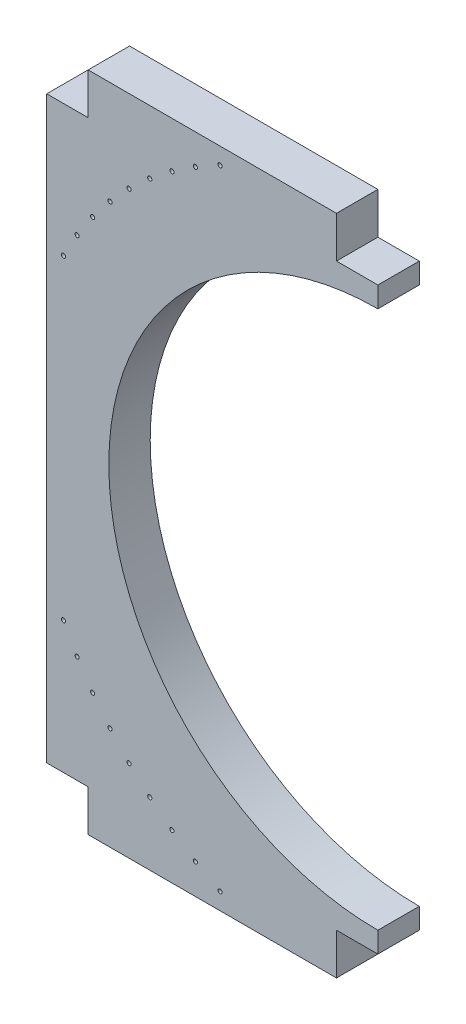
ISO-10303-21;
HEADER;
FILE_DESCRIPTION(('STEP AP214'),'2;1');
FILE_NAME('part.step','',(''),(''),'','','');
FILE_SCHEMA(('AUTOMOTIVE_DESIGN { 1 0 10303 214 1 1 1 1 }'));
ENDSEC;
DATA;
#1=APPLICATION_CONTEXT('core data for automotive mechanical design processes');
#2=APPLICATION_PROTOCOL_DEFINITION('international standard','automotive_design',2000,#1);
#3=PRODUCT_CONTEXT('',#1,'mechanical');
#4=PRODUCT('Part','Part','',(#3));
#5=PRODUCT_RELATED_PRODUCT_CATEGORY('part','',(#4));
#6=PRODUCT_DEFINITION_FORMATION('','',#4);
#7=PRODUCT_DEFINITION_CONTEXT('part definition',#1,'design');
#8=PRODUCT_DEFINITION('design','',#6,#7);
#9=PRODUCT_DEFINITION_SHAPE('','',#8);
#10=(LENGTH_UNIT() NAMED_UNIT(*) SI_UNIT(.MILLI.,.METRE.));
#11=(NAMED_UNIT(*) PLANE_ANGLE_UNIT() SI_UNIT($,.RADIAN.));
#12=(NAMED_UNIT(*) SI_UNIT($,.STERADIAN.) SOLID_ANGLE_UNIT());
#13=UNCERTAINTY_MEASURE_WITH_UNIT(LENGTH_MEASURE(1.E-05),#10,'distance_accuracy_value','');
#14=(GEOMETRIC_REPRESENTATION_CONTEXT(3) GLOBAL_UNCERTAINTY_ASSIGNED_CONTEXT((#13)) GLOBAL_UNIT_ASSIGNED_CONTEXT((#10,
#11,#12)) REPRESENTATION_CONTEXT('',''));
#15=CARTESIAN_POINT('',(0.,0.,0.));
#16=DIRECTION('',(0.,0.,1.));
#17=DIRECTION('',(1.,0.,0.));
#18=AXIS2_PLACEMENT_3D('',#15,#16,#17);
#19=CARTESIAN_POINT('',(40.,40.,5.));
#20=DIRECTION('',(0.,0.,-1.));
#21=DIRECTION('',(-1.,0.,0.));
#22=AXIS2_PLACEMENT_3D('',#19,#20,#21);
#23=PLANE('',#22);
#24=CARTESIAN_POINT('',(7.64188936617194,12.4463672774543,5.));
#25=DIRECTION('',(0.,0.,1.));
#26=DIRECTION('',(-1.,0.,0.));
#27=AXIS2_PLACEMENT_3D('',#24,#25,#26);
#28=CIRCLE('',#27,0.249999999999996);
#29=CARTESIAN_POINT('',(7.39188936617194,12.4463672774543,5.));
#30=VERTEX_POINT('',#29);
#31=EDGE_CURVE('E291',#30,#30,#28,.T.);
#32=ORIENTED_EDGE('',*,*,#31,.F.);
#33=EDGE_LOOP('',(#32));
#34=FACE_BOUND('',#33,.T.);
#35=CARTESIAN_POINT('',(3.66445369890403,17.9550895896375,5.));
#36=DIRECTION('',(0.,0.,1.));
#37=DIRECTION('',(-1.,0.,0.));
#38=AXIS2_PLACEMENT_3D('',#35,#36,#37);
#39=CIRCLE('',#38,0.250000000000001);
#40=CARTESIAN_POINT('',(3.41445369890403,17.9550895896375,5.));
#41=VERTEX_POINT('',#40);
#42=EDGE_CURVE('E279',#41,#41,#39,.T.);
#43=ORIENTED_EDGE('',*,*,#42,.F.);
#44=EDGE_LOOP('',(#43));
#45=FACE_BOUND('',#44,.T.);
#46=CARTESIAN_POINT('',(20.9301506011402,2.01854605330642,5.));
#47=DIRECTION('',(0.,0.,1.));
#48=DIRECTION('',(1.,0.,0.));
#49=AXIS2_PLACEMENT_3D('',#46,#47,#48);
#50=CIRCLE('',#49,0.25000000000001);
#51=CARTESIAN_POINT('',(21.1801506011402,2.01854605330642,5.));
#52=VERTEX_POINT('',#51);
#53=EDGE_CURVE('E267',#52,#52,#50,.T.);
#54=ORIENTED_EDGE('',*,*,#53,.F.);
#55=EDGE_LOOP('',(#54));
#56=FACE_BOUND('',#55,.T.);
#57=CARTESIAN_POINT('',(15.1211160047611,5.54290884082863,5.));
#58=DIRECTION('',(0.,0.,1.));
#59=DIRECTION('',(1.,0.,0.));
#60=AXIS2_PLACEMENT_3D('',#57,#58,#59);
#61=CIRCLE('',#60,0.25);
#62=CARTESIAN_POINT('',(15.3711160047611,5.54290884082863,5.));
#63=VERTEX_POINT('',#62);
#64=EDGE_CURVE('E255',#63,#63,#61,.T.);
#65=ORIENTED_EDGE('',*,*,#64,.F.);
#66=EDGE_LOOP('',(#65));
#67=FACE_BOUND('',#66,.T.);
#68=CARTESIAN_POINT('',(12.4463672774543,72.3581106338281,5.));
#69=DIRECTION('',(0.,0.,1.));
#70=DIRECTION('',(-1.,0.,0.));
#71=AXIS2_PLACEMENT_3D('',#68,#69,#70);
#72=CIRCLE('',#71,0.25);
#73=CARTESIAN_POINT('',(12.1963672774543,72.3581106338281,5.));
#74=VERTEX_POINT('',#73);
#75=EDGE_CURVE('E243',#74,#74,#72,.T.);
#76=ORIENTED_EDGE('',*,*,#75,.F.);
#77=EDGE_LOOP('',(#76));
#78=FACE_BOUND('',#77,.T.);
#79=CARTESIAN_POINT('',(17.9550895896375,76.335546301096,5.));
#80=DIRECTION('',(0.,0.,1.));
#81=DIRECTION('',(-1.,0.,0.));
#82=AXIS2_PLACEMENT_3D('',#79,#80,#81);
#83=CIRCLE('',#82,0.25);
#84=CARTESIAN_POINT('',(17.7050895896375,76.335546301096,5.));
#85=VERTEX_POINT('',#84);
#86=EDGE_CURVE('E231',#85,#85,#83,.T.);
#87=ORIENTED_EDGE('',*,*,#86,.F.);
#88=EDGE_LOOP('',(#87));
#89=FACE_BOUND('',#88,.T.);
#90=CARTESIAN_POINT('',(5.54290884082862,64.8788839952389,5.));
#91=DIRECTION('',(0.,0.,1.));
#92=DIRECTION('',(1.,0.,0.));
#93=AXIS2_PLACEMENT_3D('',#90,#91,#92);
#94=CIRCLE('',#93,0.249999999999999);
#95=CARTESIAN_POINT('',(5.79290884082862,64.8788839952389,5.));
#96=VERTEX_POINT('',#95);
#97=EDGE_CURVE('E219',#96,#96,#94,.T.);
#98=ORIENTED_EDGE('',*,*,#97,.F.);
#99=EDGE_LOOP('',(#98));
#100=FACE_BOUND('',#99,.T.);
#101=CARTESIAN_POINT('',(9.94796179957173,70.0520382004283,5.));
#102=DIRECTION('',(0.,0.,1.));
#103=DIRECTION('',(1.,0.,0.));
#104=AXIS2_PLACEMENT_3D('',#101,#102,#103);
#105=CIRCLE('',#104,0.249999999999997);
#106=CARTESIAN_POINT('',(10.1979617995717,70.0520382004283,5.));
#107=VERTEX_POINT('',#106);
#108=EDGE_CURVE('E207',#107,#107,#105,.T.);
#109=ORIENTED_EDGE('',*,*,#108,.F.);
#110=EDGE_LOOP('',(#109));
#111=FACE_BOUND('',#110,.T.);
#112=CARTESIAN_POINT('',(2.01854605330643,59.0698493988599,5.));
#113=DIRECTION('',(0.,0.,1.));
#114=DIRECTION('',(1.,0.,0.));
#115=AXIS2_PLACEMENT_3D('',#112,#113,#114);
#116=CIRCLE('',#115,0.249999999999996);
#117=CARTESIAN_POINT('',(2.26854605330642,59.0698493988599,5.));
#118=VERTEX_POINT('',#117);
#119=EDGE_CURVE('E160',#118,#118,#116,.T.);
#120=ORIENTED_EDGE('',*,*,#119,.F.);
#121=EDGE_LOOP('',(#120));
#122=FACE_BOUND('',#121,.T.);
#123=DIRECTION('',(-1.,0.,0.));
#124=VECTOR('',#123,1.);
#125=CARTESIAN_POINT('',(0.,80.,5.));
#126=LINE('',#125,#124);
#127=CARTESIAN_POINT('',(35.0000000000002,80.,5.));
#128=VERTEX_POINT('',#127);
#129=CARTESIAN_POINT('',(4.99999999999936,80.,5.));
#130=VERTEX_POINT('',#129);
#131=EDGE_CURVE('E169',#128,#130,#126,.T.);
#132=ORIENTED_EDGE('',*,*,#131,.T.);
#133=DIRECTION('',(0.,1.,0.));
#134=VECTOR('',#133,1.);
#135=CARTESIAN_POINT('',(4.99999999999926,80.0000000000001,5.));
#136=LINE('',#135,#134);
#137=CARTESIAN_POINT('',(4.99999999999936,75.0000000000001,5.));
#138=VERTEX_POINT('',#137);
#139=EDGE_CURVE('E48',#138,#130,#136,.T.);
#140=ORIENTED_EDGE('',*,*,#139,.F.);
#141=DIRECTION('',(1.,0.,0.));
#142=VECTOR('',#141,1.);
#143=CARTESIAN_POINT('',(-6.43582409587391E-13,75.,5.));
#144=LINE('',#143,#142);
#145=CARTESIAN_POINT('',(-6.43582409587391E-13,75.,5.));
#146=VERTEX_POINT('',#145);
#147=EDGE_CURVE('E358',#146,#138,#144,.T.);
#148=ORIENTED_EDGE('',*,*,#147,.F.);
#149=DIRECTION('',(0.,-1.,0.));
#150=VECTOR('',#149,1.);
#151=CARTESIAN_POINT('',(0.,80.,5.));
#152=LINE('',#151,#150);
#153=CARTESIAN_POINT('',(0.,5.,5.));
#154=VERTEX_POINT('',#153);
#155=EDGE_CURVE('E151',#146,#154,#152,.T.);
#156=ORIENTED_EDGE('',*,*,#155,.T.);
#157=DIRECTION('',(-1.,0.,0.));
#158=VECTOR('',#157,1.);
#159=CARTESIAN_POINT('',(0.,5.,5.));
#160=LINE('',#159,#158);
#161=CARTESIAN_POINT('',(5.,5.,5.));
#162=VERTEX_POINT('',#161);
#163=EDGE_CURVE('E311',#162,#154,#160,.T.);
#164=ORIENTED_EDGE('',*,*,#163,.F.);
#165=DIRECTION('',(0.,1.,0.));
#166=VECTOR('',#165,1.);
#167=CARTESIAN_POINT('',(5.,0.,5.));
#168=LINE('',#167,#166);
#169=CARTESIAN_POINT('',(5.,0.,5.));
#170=VERTEX_POINT('',#169);
#171=EDGE_CURVE('E315',#170,#162,#168,.T.);
#172=ORIENTED_EDGE('',*,*,#171,.F.);
#173=DIRECTION('',(1.,0.,0.));
#174=VECTOR('',#173,1.);
#175=CARTESIAN_POINT('',(0.,0.,5.));
#176=LINE('',#175,#174);
#177=CARTESIAN_POINT('',(35.0000000000002,0.,5.));
#178=VERTEX_POINT('',#177);
#179=EDGE_CURVE('E197',#170,#178,#176,.T.);
#180=ORIENTED_EDGE('',*,*,#179,.T.);
#181=DIRECTION('',(0.,-1.,0.));
#182=VECTOR('',#181,1.);
#183=CARTESIAN_POINT('',(35.0000000000002,5.,5.));
#184=LINE('',#183,#182);
#185=CARTESIAN_POINT('',(35.0000000000002,5.,5.));
#186=VERTEX_POINT('',#185);
#187=EDGE_CURVE('E332',#186,#178,#184,.T.);
#188=ORIENTED_EDGE('',*,*,#187,.F.);
#189=DIRECTION('',(-1.,0.,0.));
#190=VECTOR('',#189,1.);
#191=CARTESIAN_POINT('',(35.0000000000002,5.,5.));
#192=LINE('',#191,#190);
#193=CARTESIAN_POINT('',(40.,5.,5.));
#194=VERTEX_POINT('',#193);
#195=EDGE_CURVE('E328',#194,#186,#192,.T.);
#196=ORIENTED_EDGE('',*,*,#195,.F.);
#197=DIRECTION('',(0.,1.,0.));
#198=VECTOR('',#197,1.);
#199=CARTESIAN_POINT('',(40.,0.,5.));
#200=LINE('',#199,#198);
#201=CARTESIAN_POINT('',(40.,7.5,5.));
#202=VERTEX_POINT('',#201);
#203=EDGE_CURVE('E193',#194,#202,#200,.T.);
#204=ORIENTED_EDGE('',*,*,#203,.T.);
#205=CARTESIAN_POINT('',(40.,40.,5.));
#206=DIRECTION('',(0.,0.,-1.));
#207=DIRECTION('',(-1.,0.,0.));
#208=AXIS2_PLACEMENT_3D('',#205,#206,#207);
#209=CIRCLE('',#208,32.5);
#210=CARTESIAN_POINT('',(40.,72.5,5.));
#211=VERTEX_POINT('',#210);
#212=EDGE_CURVE('E191',#202,#211,#209,.T.);
#213=ORIENTED_EDGE('',*,*,#212,.T.);
#214=DIRECTION('',(0.,1.,0.));
#215=VECTOR('',#214,1.);
#216=CARTESIAN_POINT('',(40.,80.,5.));
#217=LINE('',#216,#215);
#218=CARTESIAN_POINT('',(40.0000000000002,75.,5.));
#219=VERTEX_POINT('',#218);
#220=EDGE_CURVE('E186',#211,#219,#217,.T.);
#221=ORIENTED_EDGE('',*,*,#220,.T.);
#222=DIRECTION('',(1.,0.,0.));
#223=VECTOR('',#222,1.);
#224=CARTESIAN_POINT('',(35.0000000000002,75.,5.));
#225=LINE('',#224,#223);
#226=CARTESIAN_POINT('',(35.0000000000002,75.,5.));
#227=VERTEX_POINT('',#226);
#228=EDGE_CURVE('E349',#227,#219,#225,.T.);
#229=ORIENTED_EDGE('',*,*,#228,.F.);
#230=DIRECTION('',(0.,-1.,0.));
#231=VECTOR('',#230,1.);
#232=CARTESIAN_POINT('',(35.0000000000002,75.,5.));
#233=LINE('',#232,#231);
#234=EDGE_CURVE('E345',#128,#227,#233,.T.);
#235=ORIENTED_EDGE('',*,*,#234,.F.);
#236=EDGE_LOOP('',(#132,#140,#148,#156,#164,#172,#180,#188,#196,#204,#213,#221,#229,#235));
#237=FACE_BOUND('',#236,.T.);
#238=CARTESIAN_POINT('',(7.64188936617192,67.5536327225458,5.));
#239=DIRECTION('',(0.,0.,1.));
#240=DIRECTION('',(1.,0.,0.));
#241=AXIS2_PLACEMENT_3D('',#238,#239,#240);
#242=CIRCLE('',#241,0.249999999999999);
#243=CARTESIAN_POINT('',(7.89188936617192,67.5536327225458,5.));
#244=VERTEX_POINT('',#243);
#245=EDGE_CURVE('E202',#244,#244,#242,.T.);
#246=ORIENTED_EDGE('',*,*,#245,.F.);
#247=EDGE_LOOP('',(#246));
#248=FACE_BOUND('',#247,.T.);
#249=CARTESIAN_POINT('',(3.66445369890402,62.0449104103626,5.));
#250=DIRECTION('',(0.,0.,1.));
#251=DIRECTION('',(1.,0.,0.));
#252=AXIS2_PLACEMENT_3D('',#249,#250,#251);
#253=CIRCLE('',#252,0.249999999999997);
#254=CARTESIAN_POINT('',(3.91445369890401,62.0449104103626,5.));
#255=VERTEX_POINT('',#254);
#256=EDGE_CURVE('E213',#255,#255,#253,.T.);
#257=ORIENTED_EDGE('',*,*,#256,.F.);
#258=EDGE_LOOP('',(#257));
#259=FACE_BOUND('',#258,.T.);
#260=CARTESIAN_POINT('',(20.9301506011402,77.9814539466936,5.));
#261=DIRECTION('',(0.,0.,1.));
#262=DIRECTION('',(-1.,0.,0.));
#263=AXIS2_PLACEMENT_3D('',#260,#261,#262);
#264=CIRCLE('',#263,0.25000000000001);
#265=CARTESIAN_POINT('',(20.6801506011402,77.9814539466936,5.));
#266=VERTEX_POINT('',#265);
#267=EDGE_CURVE('E225',#266,#266,#264,.T.);
#268=ORIENTED_EDGE('',*,*,#267,.F.);
#269=EDGE_LOOP('',(#268));
#270=FACE_BOUND('',#269,.T.);
#271=CARTESIAN_POINT('',(15.1211160047611,74.4570911591714,5.));
#272=DIRECTION('',(0.,0.,1.));
#273=DIRECTION('',(-1.,0.,0.));
#274=AXIS2_PLACEMENT_3D('',#271,#272,#273);
#275=CIRCLE('',#274,0.25);
#276=CARTESIAN_POINT('',(14.8711160047611,74.4570911591714,5.));
#277=VERTEX_POINT('',#276);
#278=EDGE_CURVE('E237',#277,#277,#275,.T.);
#279=ORIENTED_EDGE('',*,*,#278,.F.);
#280=EDGE_LOOP('',(#279));
#281=FACE_BOUND('',#280,.T.);
#282=CARTESIAN_POINT('',(12.4463672774543,7.64188936617192,5.));
#283=DIRECTION('',(0.,0.,1.));
#284=DIRECTION('',(1.,0.,0.));
#285=AXIS2_PLACEMENT_3D('',#282,#283,#284);
#286=CIRCLE('',#285,0.25);
#287=CARTESIAN_POINT('',(12.6963672774543,7.64188936617192,5.));
#288=VERTEX_POINT('',#287);
#289=EDGE_CURVE('E249',#288,#288,#286,.T.);
#290=ORIENTED_EDGE('',*,*,#289,.F.);
#291=EDGE_LOOP('',(#290));
#292=FACE_BOUND('',#291,.T.);
#293=CARTESIAN_POINT('',(17.9550895896375,3.66445369890402,5.));
#294=DIRECTION('',(0.,0.,1.));
#295=DIRECTION('',(1.,0.,0.));
#296=AXIS2_PLACEMENT_3D('',#293,#294,#295);
#297=CIRCLE('',#296,0.25);
#298=CARTESIAN_POINT('',(18.2050895896375,3.66445369890402,5.));
#299=VERTEX_POINT('',#298);
#300=EDGE_CURVE('E261',#299,#299,#297,.T.);
#301=ORIENTED_EDGE('',*,*,#300,.F.);
#302=EDGE_LOOP('',(#301));
#303=FACE_BOUND('',#302,.T.);
#304=CARTESIAN_POINT('',(5.54290884082864,15.1211160047611,5.));
#305=DIRECTION('',(0.,0.,1.));
#306=DIRECTION('',(-1.,0.,0.));
#307=AXIS2_PLACEMENT_3D('',#304,#305,#306);
#308=CIRCLE('',#307,0.250000000000001);
#309=CARTESIAN_POINT('',(5.29290884082864,15.1211160047611,5.));
#310=VERTEX_POINT('',#309);
#311=EDGE_CURVE('E273',#310,#310,#308,.T.);
#312=ORIENTED_EDGE('',*,*,#311,.F.);
#313=EDGE_LOOP('',(#312));
#314=FACE_BOUND('',#313,.T.);
#315=CARTESIAN_POINT('',(9.94796179957173,9.94796179957173,5.));
#316=DIRECTION('',(0.,0.,1.));
#317=DIRECTION('',(-1.,0.,0.));
#318=AXIS2_PLACEMENT_3D('',#315,#316,#317);
#319=CIRCLE('',#318,0.25);
#320=CARTESIAN_POINT('',(9.69796179957173,9.94796179957173,5.));
#321=VERTEX_POINT('',#320);
#322=EDGE_CURVE('E285',#321,#321,#319,.T.);
#323=ORIENTED_EDGE('',*,*,#322,.F.);
#324=EDGE_LOOP('',(#323));
#325=FACE_BOUND('',#324,.T.);
#326=CARTESIAN_POINT('',(2.01854605330644,20.9301506011402,5.));
#327=DIRECTION('',(0.,0.,1.));
#328=DIRECTION('',(-1.,0.,0.));
#329=AXIS2_PLACEMENT_3D('',#326,#327,#328);
#330=CIRCLE('',#329,0.25);
#331=CARTESIAN_POINT('',(1.76854605330644,20.9301506011402,5.));
#332=VERTEX_POINT('',#331);
#333=EDGE_CURVE('E297',#332,#332,#330,.T.);
#334=ORIENTED_EDGE('',*,*,#333,.F.);
#335=EDGE_LOOP('',(#334));
#336=FACE_BOUND('',#335,.T.);
#337=ADVANCED_FACE('F33',(#34,#45,#56,#67,#78,#89,#100,#111,#122,#237,#248,#259,#270,#281,#292,
#303,#314,#325,#336),#23,.F.);
#338=CARTESIAN_POINT('',(40.,40.,0.));
#339=DIRECTION('',(0.,0.,-1.));
#340=DIRECTION('',(-1.,0.,0.));
#341=AXIS2_PLACEMENT_3D('',#338,#339,#340);
#342=PLANE('',#341);
#343=DIRECTION('',(0.,1.,0.));
#344=VECTOR('',#343,1.);
#345=CARTESIAN_POINT('',(4.99999999999926,80.0000000000001,0.));
#346=LINE('',#345,#344);
#347=CARTESIAN_POINT('',(4.99999999999936,75.0000000000001,0.));
#348=VERTEX_POINT('',#347);
#349=CARTESIAN_POINT('',(4.99999999999926,80.0000000000001,0.));
#350=VERTEX_POINT('',#349);
#351=EDGE_CURVE('E144',#348,#350,#346,.T.);
#352=ORIENTED_EDGE('',*,*,#351,.T.);
#353=DIRECTION('',(-1.,0.,0.));
#354=VECTOR('',#353,1.);
#355=CARTESIAN_POINT('',(0.,80.,0.));
#356=LINE('',#355,#354);
#357=CARTESIAN_POINT('',(35.0000000000002,80.,0.));
#358=VERTEX_POINT('',#357);
#359=EDGE_CURVE('E178',#358,#350,#356,.T.);
#360=ORIENTED_EDGE('',*,*,#359,.F.);
#361=DIRECTION('',(0.,-1.,0.));
#362=VECTOR('',#361,1.);
#363=CARTESIAN_POINT('',(35.0000000000002,75.,0.));
#364=LINE('',#363,#362);
#365=CARTESIAN_POINT('',(35.0000000000002,75.,0.));
#366=VERTEX_POINT('',#365);
#367=EDGE_CURVE('E56',#358,#366,#364,.T.);
#368=ORIENTED_EDGE('',*,*,#367,.T.);
#369=DIRECTION('',(1.,0.,0.));
#370=VECTOR('',#369,1.);
#371=CARTESIAN_POINT('',(35.0000000000002,75.,0.));
#372=LINE('',#371,#370);
#373=CARTESIAN_POINT('',(40.0000000000002,75.,0.));
#374=VERTEX_POINT('',#373);
#375=EDGE_CURVE('E348',#366,#374,#372,.T.);
#376=ORIENTED_EDGE('',*,*,#375,.T.);
#377=DIRECTION('',(0.,1.,0.));
#378=VECTOR('',#377,1.);
#379=CARTESIAN_POINT('',(40.,80.,0.));
#380=LINE('',#379,#378);
#381=CARTESIAN_POINT('',(40.,72.5,0.));
#382=VERTEX_POINT('',#381);
#383=EDGE_CURVE('E175',#382,#374,#380,.T.);
#384=ORIENTED_EDGE('',*,*,#383,.F.);
#385=CARTESIAN_POINT('',(40.,40.,0.));
#386=DIRECTION('',(0.,0.,-1.));
#387=DIRECTION('',(-1.,0.,0.));
#388=AXIS2_PLACEMENT_3D('',#385,#386,#387);
#389=CIRCLE('',#388,32.5);
#390=CARTESIAN_POINT('',(40.,7.5,0.));
#391=VERTEX_POINT('',#390);
#392=EDGE_CURVE('E173',#391,#382,#389,.T.);
#393=ORIENTED_EDGE('',*,*,#392,.F.);
#394=DIRECTION('',(0.,1.,0.));
#395=VECTOR('',#394,1.);
#396=CARTESIAN_POINT('',(40.,0.,0.));
#397=LINE('',#396,#395);
#398=CARTESIAN_POINT('',(40.,5.,0.));
#399=VERTEX_POINT('',#398);
#400=EDGE_CURVE('E163',#399,#391,#397,.T.);
#401=ORIENTED_EDGE('',*,*,#400,.F.);
#402=DIRECTION('',(-1.,0.,0.));
#403=VECTOR('',#402,1.);
#404=CARTESIAN_POINT('',(35.0000000000002,5.,0.));
#405=LINE('',#404,#403);
#406=CARTESIAN_POINT('',(35.0000000000002,5.,0.));
#407=VERTEX_POINT('',#406);
#408=EDGE_CURVE('E325',#399,#407,#405,.T.);
#409=ORIENTED_EDGE('',*,*,#408,.T.);
#410=DIRECTION('',(0.,-1.,0.));
#411=VECTOR('',#410,1.);
#412=CARTESIAN_POINT('',(35.0000000000002,5.,0.));
#413=LINE('',#412,#411);
#414=CARTESIAN_POINT('',(35.0000000000002,0.,0.));
#415=VERTEX_POINT('',#414);
#416=EDGE_CURVE('E331',#407,#415,#413,.T.);
#417=ORIENTED_EDGE('',*,*,#416,.T.);
#418=DIRECTION('',(1.,0.,0.));
#419=VECTOR('',#418,1.);
#420=CARTESIAN_POINT('',(0.,0.,0.));
#421=LINE('',#420,#419);
#422=CARTESIAN_POINT('',(5.,0.,0.));
#423=VERTEX_POINT('',#422);
#424=EDGE_CURVE('E159',#423,#415,#421,.T.);
#425=ORIENTED_EDGE('',*,*,#424,.F.);
#426=DIRECTION('',(0.,1.,0.));
#427=VECTOR('',#426,1.);
#428=CARTESIAN_POINT('',(5.,0.,0.));
#429=LINE('',#428,#427);
#430=CARTESIAN_POINT('',(5.,5.,0.));
#431=VERTEX_POINT('',#430);
#432=EDGE_CURVE('E314',#423,#431,#429,.T.);
#433=ORIENTED_EDGE('',*,*,#432,.T.);
#434=DIRECTION('',(-1.,0.,0.));
#435=VECTOR('',#434,1.);
#436=CARTESIAN_POINT('',(0.,5.,0.));
#437=LINE('',#436,#435);
#438=CARTESIAN_POINT('',(0.,5.,0.));
#439=VERTEX_POINT('',#438);
#440=EDGE_CURVE('E158',#431,#439,#437,.T.);
#441=ORIENTED_EDGE('',*,*,#440,.T.);
#442=DIRECTION('',(0.,-1.,0.));
#443=VECTOR('',#442,1.);
#444=CARTESIAN_POINT('',(0.,80.,0.));
#445=LINE('',#444,#443);
#446=CARTESIAN_POINT('',(-6.43582409587391E-13,75.,0.));
#447=VERTEX_POINT('',#446);
#448=EDGE_CURVE('E149',#447,#439,#445,.T.);
#449=ORIENTED_EDGE('',*,*,#448,.F.);
#450=DIRECTION('',(1.,0.,0.));
#451=VECTOR('',#450,1.);
#452=CARTESIAN_POINT('',(-6.43582409587391E-13,75.,0.));
#453=LINE('',#452,#451);
#454=EDGE_CURVE('E133',#447,#348,#453,.T.);
#455=ORIENTED_EDGE('',*,*,#454,.T.);
#456=EDGE_LOOP('',(#352,#360,#368,#376,#384,#393,#401,#409,#417,#425,#433,#441,#449,#455));
#457=FACE_BOUND('',#456,.T.);
#458=CARTESIAN_POINT('',(7.64188936617194,12.4463672774543,0.));
#459=DIRECTION('',(0.,0.,1.));
#460=DIRECTION('',(-1.,0.,0.));
#461=AXIS2_PLACEMENT_3D('',#458,#459,#460);
#462=CIRCLE('',#461,0.249999999999996);
#463=CARTESIAN_POINT('',(7.39188936617194,12.4463672774543,0.));
#464=VERTEX_POINT('',#463);
#465=EDGE_CURVE('E294',#464,#464,#462,.T.);
#466=ORIENTED_EDGE('',*,*,#465,.T.);
#467=EDGE_LOOP('',(#466));
#468=FACE_BOUND('',#467,.T.);
#469=CARTESIAN_POINT('',(3.66445369890403,17.9550895896375,0.));
#470=DIRECTION('',(0.,0.,1.));
#471=DIRECTION('',(-1.,0.,0.));
#472=AXIS2_PLACEMENT_3D('',#469,#470,#471);
#473=CIRCLE('',#472,0.250000000000001);
#474=CARTESIAN_POINT('',(3.41445369890403,17.9550895896375,0.));
#475=VERTEX_POINT('',#474);
#476=EDGE_CURVE('E282',#475,#475,#473,.T.);
#477=ORIENTED_EDGE('',*,*,#476,.T.);
#478=EDGE_LOOP('',(#477));
#479=FACE_BOUND('',#478,.T.);
#480=CARTESIAN_POINT('',(20.9301506011402,2.01854605330642,0.));
#481=DIRECTION('',(0.,0.,1.));
#482=DIRECTION('',(1.,0.,0.));
#483=AXIS2_PLACEMENT_3D('',#480,#481,#482);
#484=CIRCLE('',#483,0.25000000000001);
#485=CARTESIAN_POINT('',(21.1801506011402,2.01854605330642,0.));
#486=VERTEX_POINT('',#485);
#487=EDGE_CURVE('E270',#486,#486,#484,.T.);
#488=ORIENTED_EDGE('',*,*,#487,.T.);
#489=EDGE_LOOP('',(#488));
#490=FACE_BOUND('',#489,.T.);
#491=CARTESIAN_POINT('',(15.1211160047611,5.54290884082863,0.));
#492=DIRECTION('',(0.,0.,1.));
#493=DIRECTION('',(1.,0.,0.));
#494=AXIS2_PLACEMENT_3D('',#491,#492,#493);
#495=CIRCLE('',#494,0.25);
#496=CARTESIAN_POINT('',(15.3711160047611,5.54290884082863,0.));
#497=VERTEX_POINT('',#496);
#498=EDGE_CURVE('E258',#497,#497,#495,.T.);
#499=ORIENTED_EDGE('',*,*,#498,.T.);
#500=EDGE_LOOP('',(#499));
#501=FACE_BOUND('',#500,.T.);
#502=CARTESIAN_POINT('',(12.4463672774543,72.3581106338281,0.));
#503=DIRECTION('',(0.,0.,1.));
#504=DIRECTION('',(-1.,0.,0.));
#505=AXIS2_PLACEMENT_3D('',#502,#503,#504);
#506=CIRCLE('',#505,0.25);
#507=CARTESIAN_POINT('',(12.1963672774543,72.3581106338281,0.));
#508=VERTEX_POINT('',#507);
#509=EDGE_CURVE('E246',#508,#508,#506,.T.);
#510=ORIENTED_EDGE('',*,*,#509,.T.);
#511=EDGE_LOOP('',(#510));
#512=FACE_BOUND('',#511,.T.);
#513=CARTESIAN_POINT('',(17.9550895896375,76.335546301096,0.));
#514=DIRECTION('',(0.,0.,1.));
#515=DIRECTION('',(-1.,0.,0.));
#516=AXIS2_PLACEMENT_3D('',#513,#514,#515);
#517=CIRCLE('',#516,0.25);
#518=CARTESIAN_POINT('',(17.7050895896375,76.335546301096,0.));
#519=VERTEX_POINT('',#518);
#520=EDGE_CURVE('E234',#519,#519,#517,.T.);
#521=ORIENTED_EDGE('',*,*,#520,.T.);
#522=EDGE_LOOP('',(#521));
#523=FACE_BOUND('',#522,.T.);
#524=CARTESIAN_POINT('',(5.54290884082862,64.8788839952389,0.));
#525=DIRECTION('',(0.,0.,1.));
#526=DIRECTION('',(1.,0.,0.));
#527=AXIS2_PLACEMENT_3D('',#524,#525,#526);
#528=CIRCLE('',#527,0.249999999999999);
#529=CARTESIAN_POINT('',(5.79290884082862,64.8788839952389,0.));
#530=VERTEX_POINT('',#529);
#531=EDGE_CURVE('E222',#530,#530,#528,.T.);
#532=ORIENTED_EDGE('',*,*,#531,.T.);
#533=EDGE_LOOP('',(#532));
#534=FACE_BOUND('',#533,.T.);
#535=CARTESIAN_POINT('',(9.94796179957173,70.0520382004283,0.));
#536=DIRECTION('',(0.,0.,1.));
#537=DIRECTION('',(1.,0.,0.));
#538=AXIS2_PLACEMENT_3D('',#535,#536,#537);
#539=CIRCLE('',#538,0.249999999999997);
#540=CARTESIAN_POINT('',(10.1979617995717,70.0520382004283,0.));
#541=VERTEX_POINT('',#540);
#542=EDGE_CURVE('E210',#541,#541,#539,.T.);
#543=ORIENTED_EDGE('',*,*,#542,.T.);
#544=EDGE_LOOP('',(#543));
#545=FACE_BOUND('',#544,.T.);
#546=CARTESIAN_POINT('',(2.01854605330643,59.0698493988599,0.));
#547=DIRECTION('',(0.,0.,1.));
#548=DIRECTION('',(1.,0.,0.));
#549=AXIS2_PLACEMENT_3D('',#546,#547,#548);
#550=CIRCLE('',#549,0.249999999999996);
#551=CARTESIAN_POINT('',(2.26854605330642,59.0698493988599,0.));
#552=VERTEX_POINT('',#551);
#553=EDGE_CURVE('E166',#552,#552,#550,.T.);
#554=ORIENTED_EDGE('',*,*,#553,.T.);
#555=EDGE_LOOP('',(#554));
#556=FACE_BOUND('',#555,.T.);
#557=CARTESIAN_POINT('',(7.64188936617192,67.5536327225458,0.));
#558=DIRECTION('',(0.,0.,1.));
#559=DIRECTION('',(1.,0.,0.));
#560=AXIS2_PLACEMENT_3D('',#557,#558,#559);
#561=CIRCLE('',#560,0.249999999999999);
#562=CARTESIAN_POINT('',(7.89188936617192,67.5536327225458,0.));
#563=VERTEX_POINT('',#562);
#564=EDGE_CURVE('E204',#563,#563,#561,.T.);
#565=ORIENTED_EDGE('',*,*,#564,.T.);
#566=EDGE_LOOP('',(#565));
#567=FACE_BOUND('',#566,.T.);
#568=CARTESIAN_POINT('',(3.66445369890402,62.0449104103626,0.));
#569=DIRECTION('',(0.,0.,1.));
#570=DIRECTION('',(1.,0.,0.));
#571=AXIS2_PLACEMENT_3D('',#568,#569,#570);
#572=CIRCLE('',#571,0.249999999999997);
#573=CARTESIAN_POINT('',(3.91445369890401,62.0449104103626,0.));
#574=VERTEX_POINT('',#573);
#575=EDGE_CURVE('E216',#574,#574,#572,.T.);
#576=ORIENTED_EDGE('',*,*,#575,.T.);
#577=EDGE_LOOP('',(#576));
#578=FACE_BOUND('',#577,.T.);
#579=CARTESIAN_POINT('',(20.9301506011402,77.9814539466936,0.));
#580=DIRECTION('',(0.,0.,1.));
#581=DIRECTION('',(-1.,0.,0.));
#582=AXIS2_PLACEMENT_3D('',#579,#580,#581);
#583=CIRCLE('',#582,0.25000000000001);
#584=CARTESIAN_POINT('',(20.6801506011402,77.9814539466936,0.));
#585=VERTEX_POINT('',#584);
#586=EDGE_CURVE('E228',#585,#585,#583,.T.);
#587=ORIENTED_EDGE('',*,*,#586,.T.);
#588=EDGE_LOOP('',(#587));
#589=FACE_BOUND('',#588,.T.);
#590=CARTESIAN_POINT('',(15.1211160047611,74.4570911591714,0.));
#591=DIRECTION('',(0.,0.,1.));
#592=DIRECTION('',(-1.,0.,0.));
#593=AXIS2_PLACEMENT_3D('',#590,#591,#592);
#594=CIRCLE('',#593,0.25);
#595=CARTESIAN_POINT('',(14.8711160047611,74.4570911591714,0.));
#596=VERTEX_POINT('',#595);
#597=EDGE_CURVE('E240',#596,#596,#594,.T.);
#598=ORIENTED_EDGE('',*,*,#597,.T.);
#599=EDGE_LOOP('',(#598));
#600=FACE_BOUND('',#599,.T.);
#601=CARTESIAN_POINT('',(12.4463672774543,7.64188936617192,0.));
#602=DIRECTION('',(0.,0.,1.));
#603=DIRECTION('',(1.,0.,0.));
#604=AXIS2_PLACEMENT_3D('',#601,#602,#603);
#605=CIRCLE('',#604,0.25);
#606=CARTESIAN_POINT('',(12.6963672774543,7.64188936617192,0.));
#607=VERTEX_POINT('',#606);
#608=EDGE_CURVE('E252',#607,#607,#605,.T.);
#609=ORIENTED_EDGE('',*,*,#608,.T.);
#610=EDGE_LOOP('',(#609));
#611=FACE_BOUND('',#610,.T.);
#612=CARTESIAN_POINT('',(17.9550895896375,3.66445369890402,0.));
#613=DIRECTION('',(0.,0.,1.));
#614=DIRECTION('',(1.,0.,0.));
#615=AXIS2_PLACEMENT_3D('',#612,#613,#614);
#616=CIRCLE('',#615,0.25);
#617=CARTESIAN_POINT('',(18.2050895896375,3.66445369890402,0.));
#618=VERTEX_POINT('',#617);
#619=EDGE_CURVE('E264',#618,#618,#616,.T.);
#620=ORIENTED_EDGE('',*,*,#619,.T.);
#621=EDGE_LOOP('',(#620));
#622=FACE_BOUND('',#621,.T.);
#623=CARTESIAN_POINT('',(5.54290884082864,15.1211160047611,0.));
#624=DIRECTION('',(0.,0.,1.));
#625=DIRECTION('',(-1.,0.,0.));
#626=AXIS2_PLACEMENT_3D('',#623,#624,#625);
#627=CIRCLE('',#626,0.250000000000001);
#628=CARTESIAN_POINT('',(5.29290884082864,15.1211160047611,0.));
#629=VERTEX_POINT('',#628);
#630=EDGE_CURVE('E276',#629,#629,#627,.T.);
#631=ORIENTED_EDGE('',*,*,#630,.T.);
#632=EDGE_LOOP('',(#631));
#633=FACE_BOUND('',#632,.T.);
#634=CARTESIAN_POINT('',(9.94796179957173,9.94796179957173,0.));
#635=DIRECTION('',(0.,0.,1.));
#636=DIRECTION('',(-1.,0.,0.));
#637=AXIS2_PLACEMENT_3D('',#634,#635,#636);
#638=CIRCLE('',#637,0.25);
#639=CARTESIAN_POINT('',(9.69796179957173,9.94796179957173,0.));
#640=VERTEX_POINT('',#639);
#641=EDGE_CURVE('E288',#640,#640,#638,.T.);
#642=ORIENTED_EDGE('',*,*,#641,.T.);
#643=EDGE_LOOP('',(#642));
#644=FACE_BOUND('',#643,.T.);
#645=CARTESIAN_POINT('',(2.01854605330644,20.9301506011402,0.));
#646=DIRECTION('',(0.,0.,1.));
#647=DIRECTION('',(-1.,0.,0.));
#648=AXIS2_PLACEMENT_3D('',#645,#646,#647);
#649=CIRCLE('',#648,0.25);
#650=CARTESIAN_POINT('',(1.76854605330644,20.9301506011402,0.));
#651=VERTEX_POINT('',#650);
#652=EDGE_CURVE('E300',#651,#651,#649,.T.);
#653=ORIENTED_EDGE('',*,*,#652,.T.);
#654=EDGE_LOOP('',(#653));
#655=FACE_BOUND('',#654,.T.);
#656=ADVANCED_FACE('F154',(#457,#468,#479,#490,#501,#512,#523,#534,#545,#556,#567,#578,#589,
#600,#611,#622,#633,#644,#655),#342,.T.);
#657=CARTESIAN_POINT('',(0.,80.,5.));
#658=DIRECTION('',(1.,0.,0.));
#659=DIRECTION('',(0.,0.,-1.));
#660=AXIS2_PLACEMENT_3D('',#657,#658,#659);
#661=PLANE('',#660);
#662=ORIENTED_EDGE('',*,*,#155,.F.);
#663=DIRECTION('',(0.,0.,1.));
#664=VECTOR('',#663,1.);
#665=CARTESIAN_POINT('',(-6.43582409587391E-13,75.,0.));
#666=LINE('',#665,#664);
#667=EDGE_CURVE('E137',#447,#146,#666,.T.);
#668=ORIENTED_EDGE('',*,*,#667,.F.);
#669=ORIENTED_EDGE('',*,*,#448,.T.);
#670=DIRECTION('',(0.,0.,1.));
#671=VECTOR('',#670,1.);
#672=CARTESIAN_POINT('',(0.,5.,0.));
#673=LINE('',#672,#671);
#674=EDGE_CURVE('E303',#439,#154,#673,.T.);
#675=ORIENTED_EDGE('',*,*,#674,.T.);
#676=EDGE_LOOP('',(#662,#668,#669,#675));
#677=FACE_BOUND('',#676,.T.);
#678=ADVANCED_FACE('F35',(#677),#661,.F.);
#679=CARTESIAN_POINT('',(0.,0.,5.));
#680=DIRECTION('',(0.,1.,0.));
#681=DIRECTION('',(0.,0.,1.));
#682=AXIS2_PLACEMENT_3D('',#679,#680,#681);
#683=PLANE('',#682);
#684=ORIENTED_EDGE('',*,*,#424,.T.);
#685=DIRECTION('',(0.,0.,1.));
#686=VECTOR('',#685,1.);
#687=CARTESIAN_POINT('',(35.0000000000002,0.,0.));
#688=LINE('',#687,#686);
#689=EDGE_CURVE('E321',#415,#178,#688,.T.);
#690=ORIENTED_EDGE('',*,*,#689,.T.);
#691=ORIENTED_EDGE('',*,*,#179,.F.);
#692=DIRECTION('',(0.,0.,1.));
#693=VECTOR('',#692,1.);
#694=CARTESIAN_POINT('',(5.,0.,0.));
#695=LINE('',#694,#693);
#696=EDGE_CURVE('E306',#423,#170,#695,.T.);
#697=ORIENTED_EDGE('',*,*,#696,.F.);
#698=EDGE_LOOP('',(#684,#690,#691,#697));
#699=FACE_BOUND('',#698,.T.);
#700=ADVANCED_FACE('F389',(#699),#683,.F.);
#701=CARTESIAN_POINT('',(40.,0.,5.));
#702=DIRECTION('',(-1.,0.,0.));
#703=DIRECTION('',(0.,-1.,0.));
#704=AXIS2_PLACEMENT_3D('',#701,#702,#703);
#705=PLANE('',#704);
#706=ORIENTED_EDGE('',*,*,#203,.F.);
#707=DIRECTION('',(0.,0.,1.));
#708=VECTOR('',#707,1.);
#709=CARTESIAN_POINT('',(40.,5.,0.));
#710=LINE('',#709,#708);
#711=EDGE_CURVE('E324',#399,#194,#710,.T.);
#712=ORIENTED_EDGE('',*,*,#711,.F.);
#713=ORIENTED_EDGE('',*,*,#400,.T.);
#714=DIRECTION('',(0.,0.,-1.));
#715=VECTOR('',#714,1.);
#716=CARTESIAN_POINT('',(40.,7.5,5.));
#717=LINE('',#716,#715);
#718=EDGE_CURVE('E11',#202,#391,#717,.T.);
#719=ORIENTED_EDGE('',*,*,#718,.F.);
#720=EDGE_LOOP('',(#706,#712,#713,#719));
#721=FACE_BOUND('',#720,.T.);
#722=ADVANCED_FACE('F377',(#721),#705,.F.);
#723=CARTESIAN_POINT('',(40.,40.,5.));
#724=DIRECTION('',(0.,0.,-1.));
#725=DIRECTION('',(-1.,0.,0.));
#726=AXIS2_PLACEMENT_3D('',#723,#724,#725);
#727=CYLINDRICAL_SURFACE('',#726,32.5);
#728=ORIENTED_EDGE('',*,*,#392,.T.);
#729=DIRECTION('',(0.,0.,-1.));
#730=VECTOR('',#729,1.);
#731=CARTESIAN_POINT('',(40.,72.5,5.));
#732=LINE('',#731,#730);
#733=EDGE_CURVE('E41',#211,#382,#732,.T.);
#734=ORIENTED_EDGE('',*,*,#733,.F.);
#735=ORIENTED_EDGE('',*,*,#212,.F.);
#736=ORIENTED_EDGE('',*,*,#718,.T.);
#737=EDGE_LOOP('',(#728,#734,#735,#736));
#738=FACE_BOUND('',#737,.T.);
#739=ADVANCED_FACE('F372',(#738),#727,.F.);
#740=CARTESIAN_POINT('',(40.,80.,5.));
#741=DIRECTION('',(-1.,0.,0.));
#742=DIRECTION('',(0.,-1.,0.));
#743=AXIS2_PLACEMENT_3D('',#740,#741,#742);
#744=PLANE('',#743);
#745=ORIENTED_EDGE('',*,*,#383,.T.);
#746=DIRECTION('',(0.,0.,1.));
#747=VECTOR('',#746,1.);
#748=CARTESIAN_POINT('',(40.0000000000002,75.,0.));
#749=LINE('',#748,#747);
#750=EDGE_CURVE('E339',#374,#219,#749,.T.);
#751=ORIENTED_EDGE('',*,*,#750,.T.);
#752=ORIENTED_EDGE('',*,*,#220,.F.);
#753=ORIENTED_EDGE('',*,*,#733,.T.);
#754=EDGE_LOOP('',(#745,#751,#752,#753));
#755=FACE_BOUND('',#754,.T.);
#756=ADVANCED_FACE('F368',(#755),#744,.F.);
#757=CARTESIAN_POINT('',(0.,80.,5.));
#758=DIRECTION('',(0.,-1.,0.));
#759=DIRECTION('',(0.,0.,-1.));
#760=AXIS2_PLACEMENT_3D('',#757,#758,#759);
#761=PLANE('',#760);
#762=ORIENTED_EDGE('',*,*,#359,.T.);
#763=DIRECTION('',(0.,0.,1.));
#764=VECTOR('',#763,1.);
#765=CARTESIAN_POINT('',(4.99999999999926,80.0000000000001,0.));
#766=LINE('',#765,#764);
#767=EDGE_CURVE('E351',#350,#130,#766,.T.);
#768=ORIENTED_EDGE('',*,*,#767,.T.);
#769=ORIENTED_EDGE('',*,*,#131,.F.);
#770=DIRECTION('',(0.,0.,1.));
#771=VECTOR('',#770,1.);
#772=CARTESIAN_POINT('',(35.0000000000002,80.,0.));
#773=LINE('',#772,#771);
#774=EDGE_CURVE('E342',#358,#128,#773,.T.);
#775=ORIENTED_EDGE('',*,*,#774,.F.);
#776=EDGE_LOOP('',(#762,#768,#769,#775));
#777=FACE_BOUND('',#776,.T.);
#778=ADVANCED_FACE('F362',(#777),#761,.F.);
#779=CARTESIAN_POINT('',(2.01854605330643,59.0698493988599,5.));
#780=DIRECTION('',(0.,0.,-1.));
#781=DIRECTION('',(-1.,0.,0.));
#782=AXIS2_PLACEMENT_3D('',#779,#780,#781);
#783=CYLINDRICAL_SURFACE('',#782,0.249999999999996);
#784=ORIENTED_EDGE('',*,*,#119,.T.);
#785=EDGE_LOOP('',(#784));
#786=FACE_BOUND('',#785,.T.);
#787=ORIENTED_EDGE('',*,*,#553,.F.);
#788=EDGE_LOOP('',(#787));
#789=FACE_BOUND('',#788,.T.);
#790=ADVANCED_FACE('F419',(#786,#789),#783,.F.);
#791=CARTESIAN_POINT('',(7.64188936617192,67.5536327225458,5.));
#792=DIRECTION('',(0.,0.,-1.));
#793=DIRECTION('',(-1.,0.,0.));
#794=AXIS2_PLACEMENT_3D('',#791,#792,#793);
#795=CYLINDRICAL_SURFACE('',#794,0.249999999999999);
#796=ORIENTED_EDGE('',*,*,#245,.T.);
#797=EDGE_LOOP('',(#796));
#798=FACE_BOUND('',#797,.T.);
#799=ORIENTED_EDGE('',*,*,#564,.F.);
#800=EDGE_LOOP('',(#799));
#801=FACE_BOUND('',#800,.T.);
#802=ADVANCED_FACE('F599',(#798,#801),#795,.F.);
#803=CARTESIAN_POINT('',(9.94796179957173,70.0520382004283,5.));
#804=DIRECTION('',(0.,0.,-1.));
#805=DIRECTION('',(-1.,0.,0.));
#806=AXIS2_PLACEMENT_3D('',#803,#804,#805);
#807=CYLINDRICAL_SURFACE('',#806,0.249999999999997);
#808=ORIENTED_EDGE('',*,*,#108,.T.);
#809=EDGE_LOOP('',(#808));
#810=FACE_BOUND('',#809,.T.);
#811=ORIENTED_EDGE('',*,*,#542,.F.);
#812=EDGE_LOOP('',(#811));
#813=FACE_BOUND('',#812,.T.);
#814=ADVANCED_FACE('F589',(#810,#813),#807,.F.);
#815=CARTESIAN_POINT('',(3.66445369890402,62.0449104103626,5.));
#816=DIRECTION('',(0.,0.,-1.));
#817=DIRECTION('',(-1.,0.,0.));
#818=AXIS2_PLACEMENT_3D('',#815,#816,#817);
#819=CYLINDRICAL_SURFACE('',#818,0.249999999999997);
#820=ORIENTED_EDGE('',*,*,#256,.T.);
#821=EDGE_LOOP('',(#820));
#822=FACE_BOUND('',#821,.T.);
#823=ORIENTED_EDGE('',*,*,#575,.F.);
#824=EDGE_LOOP('',(#823));
#825=FACE_BOUND('',#824,.T.);
#826=ADVANCED_FACE('F579',(#822,#825),#819,.F.);
#827=CARTESIAN_POINT('',(5.54290884082862,64.8788839952389,5.));
#828=DIRECTION('',(0.,0.,-1.));
#829=DIRECTION('',(-1.,0.,0.));
#830=AXIS2_PLACEMENT_3D('',#827,#828,#829);
#831=CYLINDRICAL_SURFACE('',#830,0.249999999999999);
#832=ORIENTED_EDGE('',*,*,#97,.T.);
#833=EDGE_LOOP('',(#832));
#834=FACE_BOUND('',#833,.T.);
#835=ORIENTED_EDGE('',*,*,#531,.F.);
#836=EDGE_LOOP('',(#835));
#837=FACE_BOUND('',#836,.T.);
#838=ADVANCED_FACE('F569',(#834,#837),#831,.F.);
#839=CARTESIAN_POINT('',(20.9301506011402,77.9814539466936,5.));
#840=DIRECTION('',(0.,0.,-1.));
#841=DIRECTION('',(-1.,0.,0.));
#842=AXIS2_PLACEMENT_3D('',#839,#840,#841);
#843=CYLINDRICAL_SURFACE('',#842,0.25000000000001);
#844=ORIENTED_EDGE('',*,*,#267,.T.);
#845=EDGE_LOOP('',(#844));
#846=FACE_BOUND('',#845,.T.);
#847=ORIENTED_EDGE('',*,*,#586,.F.);
#848=EDGE_LOOP('',(#847));
#849=FACE_BOUND('',#848,.T.);
#850=ADVANCED_FACE('F559',(#846,#849),#843,.F.);
#851=CARTESIAN_POINT('',(17.9550895896375,76.335546301096,5.));
#852=DIRECTION('',(0.,0.,-1.));
#853=DIRECTION('',(-1.,0.,0.));
#854=AXIS2_PLACEMENT_3D('',#851,#852,#853);
#855=CYLINDRICAL_SURFACE('',#854,0.25);
#856=ORIENTED_EDGE('',*,*,#86,.T.);
#857=EDGE_LOOP('',(#856));
#858=FACE_BOUND('',#857,.T.);
#859=ORIENTED_EDGE('',*,*,#520,.F.);
#860=EDGE_LOOP('',(#859));
#861=FACE_BOUND('',#860,.T.);
#862=ADVANCED_FACE('F549',(#858,#861),#855,.F.);
#863=CARTESIAN_POINT('',(15.1211160047611,74.4570911591714,5.));
#864=DIRECTION('',(0.,0.,-1.));
#865=DIRECTION('',(-1.,0.,0.));
#866=AXIS2_PLACEMENT_3D('',#863,#864,#865);
#867=CYLINDRICAL_SURFACE('',#866,0.25);
#868=ORIENTED_EDGE('',*,*,#278,.T.);
#869=EDGE_LOOP('',(#868));
#870=FACE_BOUND('',#869,.T.);
#871=ORIENTED_EDGE('',*,*,#597,.F.);
#872=EDGE_LOOP('',(#871));
#873=FACE_BOUND('',#872,.T.);
#874=ADVANCED_FACE('F539',(#870,#873),#867,.F.);
#875=CARTESIAN_POINT('',(12.4463672774543,72.3581106338281,5.));
#876=DIRECTION('',(0.,0.,-1.));
#877=DIRECTION('',(-1.,0.,0.));
#878=AXIS2_PLACEMENT_3D('',#875,#876,#877);
#879=CYLINDRICAL_SURFACE('',#878,0.25);
#880=ORIENTED_EDGE('',*,*,#75,.T.);
#881=EDGE_LOOP('',(#880));
#882=FACE_BOUND('',#881,.T.);
#883=ORIENTED_EDGE('',*,*,#509,.F.);
#884=EDGE_LOOP('',(#883));
#885=FACE_BOUND('',#884,.T.);
#886=ADVANCED_FACE('F529',(#882,#885),#879,.F.);
#887=CARTESIAN_POINT('',(12.4463672774543,7.64188936617192,5.));
#888=DIRECTION('',(0.,0.,-1.));
#889=DIRECTION('',(-1.,0.,0.));
#890=AXIS2_PLACEMENT_3D('',#887,#888,#889);
#891=CYLINDRICAL_SURFACE('',#890,0.25);
#892=ORIENTED_EDGE('',*,*,#289,.T.);
#893=EDGE_LOOP('',(#892));
#894=FACE_BOUND('',#893,.T.);
#895=ORIENTED_EDGE('',*,*,#608,.F.);
#896=EDGE_LOOP('',(#895));
#897=FACE_BOUND('',#896,.T.);
#898=ADVANCED_FACE('F519',(#894,#897),#891,.F.);
#899=CARTESIAN_POINT('',(15.1211160047611,5.54290884082863,5.));
#900=DIRECTION('',(0.,0.,-1.));
#901=DIRECTION('',(-1.,0.,0.));
#902=AXIS2_PLACEMENT_3D('',#899,#900,#901);
#903=CYLINDRICAL_SURFACE('',#902,0.25);
#904=ORIENTED_EDGE('',*,*,#64,.T.);
#905=EDGE_LOOP('',(#904));
#906=FACE_BOUND('',#905,.T.);
#907=ORIENTED_EDGE('',*,*,#498,.F.);
#908=EDGE_LOOP('',(#907));
#909=FACE_BOUND('',#908,.T.);
#910=ADVANCED_FACE('F509',(#906,#909),#903,.F.);
#911=CARTESIAN_POINT('',(17.9550895896375,3.66445369890402,5.));
#912=DIRECTION('',(0.,0.,-1.));
#913=DIRECTION('',(-1.,0.,0.));
#914=AXIS2_PLACEMENT_3D('',#911,#912,#913);
#915=CYLINDRICAL_SURFACE('',#914,0.25);
#916=ORIENTED_EDGE('',*,*,#300,.T.);
#917=EDGE_LOOP('',(#916));
#918=FACE_BOUND('',#917,.T.);
#919=ORIENTED_EDGE('',*,*,#619,.F.);
#920=EDGE_LOOP('',(#919));
#921=FACE_BOUND('',#920,.T.);
#922=ADVANCED_FACE('F499',(#918,#921),#915,.F.);
#923=CARTESIAN_POINT('',(20.9301506011402,2.01854605330642,5.));
#924=DIRECTION('',(0.,0.,-1.));
#925=DIRECTION('',(-1.,0.,0.));
#926=AXIS2_PLACEMENT_3D('',#923,#924,#925);
#927=CYLINDRICAL_SURFACE('',#926,0.25000000000001);
#928=ORIENTED_EDGE('',*,*,#53,.T.);
#929=EDGE_LOOP('',(#928));
#930=FACE_BOUND('',#929,.T.);
#931=ORIENTED_EDGE('',*,*,#487,.F.);
#932=EDGE_LOOP('',(#931));
#933=FACE_BOUND('',#932,.T.);
#934=ADVANCED_FACE('F489',(#930,#933),#927,.F.);
#935=CARTESIAN_POINT('',(5.54290884082864,15.1211160047611,5.));
#936=DIRECTION('',(0.,0.,-1.));
#937=DIRECTION('',(-1.,0.,0.));
#938=AXIS2_PLACEMENT_3D('',#935,#936,#937);
#939=CYLINDRICAL_SURFACE('',#938,0.250000000000001);
#940=ORIENTED_EDGE('',*,*,#311,.T.);
#941=EDGE_LOOP('',(#940));
#942=FACE_BOUND('',#941,.T.);
#943=ORIENTED_EDGE('',*,*,#630,.F.);
#944=EDGE_LOOP('',(#943));
#945=FACE_BOUND('',#944,.T.);
#946=ADVANCED_FACE('F479',(#942,#945),#939,.F.);
#947=CARTESIAN_POINT('',(3.66445369890403,17.9550895896375,5.));
#948=DIRECTION('',(0.,0.,-1.));
#949=DIRECTION('',(-1.,0.,0.));
#950=AXIS2_PLACEMENT_3D('',#947,#948,#949);
#951=CYLINDRICAL_SURFACE('',#950,0.250000000000001);
#952=ORIENTED_EDGE('',*,*,#42,.T.);
#953=EDGE_LOOP('',(#952));
#954=FACE_BOUND('',#953,.T.);
#955=ORIENTED_EDGE('',*,*,#476,.F.);
#956=EDGE_LOOP('',(#955));
#957=FACE_BOUND('',#956,.T.);
#958=ADVANCED_FACE('F469',(#954,#957),#951,.F.);
#959=CARTESIAN_POINT('',(9.94796179957173,9.94796179957173,5.));
#960=DIRECTION('',(0.,0.,-1.));
#961=DIRECTION('',(-1.,0.,0.));
#962=AXIS2_PLACEMENT_3D('',#959,#960,#961);
#963=CYLINDRICAL_SURFACE('',#962,0.25);
#964=ORIENTED_EDGE('',*,*,#322,.T.);
#965=EDGE_LOOP('',(#964));
#966=FACE_BOUND('',#965,.T.);
#967=ORIENTED_EDGE('',*,*,#641,.F.);
#968=EDGE_LOOP('',(#967));
#969=FACE_BOUND('',#968,.T.);
#970=ADVANCED_FACE('F459',(#966,#969),#963,.F.);
#971=CARTESIAN_POINT('',(7.64188936617194,12.4463672774543,5.));
#972=DIRECTION('',(0.,0.,-1.));
#973=DIRECTION('',(-1.,0.,0.));
#974=AXIS2_PLACEMENT_3D('',#971,#972,#973);
#975=CYLINDRICAL_SURFACE('',#974,0.249999999999996);
#976=ORIENTED_EDGE('',*,*,#31,.T.);
#977=EDGE_LOOP('',(#976));
#978=FACE_BOUND('',#977,.T.);
#979=ORIENTED_EDGE('',*,*,#465,.F.);
#980=EDGE_LOOP('',(#979));
#981=FACE_BOUND('',#980,.T.);
#982=ADVANCED_FACE('F405',(#978,#981),#975,.F.);
#983=CARTESIAN_POINT('',(2.01854605330644,20.9301506011402,5.));
#984=DIRECTION('',(0.,0.,-1.));
#985=DIRECTION('',(-1.,0.,0.));
#986=AXIS2_PLACEMENT_3D('',#983,#984,#985);
#987=CYLINDRICAL_SURFACE('',#986,0.25);
#988=ORIENTED_EDGE('',*,*,#333,.T.);
#989=EDGE_LOOP('',(#988));
#990=FACE_BOUND('',#989,.T.);
#991=ORIENTED_EDGE('',*,*,#652,.F.);
#992=EDGE_LOOP('',(#991));
#993=FACE_BOUND('',#992,.T.);
#994=ADVANCED_FACE('F398',(#990,#993),#987,.F.);
#995=CARTESIAN_POINT('',(0.,5.,0.));
#996=DIRECTION('',(0.,1.,0.));
#997=DIRECTION('',(0.,0.,1.));
#998=AXIS2_PLACEMENT_3D('',#995,#996,#997);
#999=PLANE('',#998);
#1000=ORIENTED_EDGE('',*,*,#163,.T.);
#1001=ORIENTED_EDGE('',*,*,#674,.F.);
#1002=ORIENTED_EDGE('',*,*,#440,.F.);
#1003=DIRECTION('',(0.,0.,1.));
#1004=VECTOR('',#1003,1.);
#1005=CARTESIAN_POINT('',(5.,5.,0.));
#1006=LINE('',#1005,#1004);
#1007=EDGE_CURVE('E308',#431,#162,#1006,.T.);
#1008=ORIENTED_EDGE('',*,*,#1007,.T.);
#1009=EDGE_LOOP('',(#1000,#1001,#1002,#1008));
#1010=FACE_BOUND('',#1009,.T.);
#1011=ADVANCED_FACE('F396',(#1010),#999,.F.);
#1012=CARTESIAN_POINT('',(5.,0.,0.));
#1013=DIRECTION('',(1.,0.,0.));
#1014=DIRECTION('',(0.,0.,-1.));
#1015=AXIS2_PLACEMENT_3D('',#1012,#1013,#1014);
#1016=PLANE('',#1015);
#1017=ORIENTED_EDGE('',*,*,#171,.T.);
#1018=ORIENTED_EDGE('',*,*,#1007,.F.);
#1019=ORIENTED_EDGE('',*,*,#432,.F.);
#1020=ORIENTED_EDGE('',*,*,#696,.T.);
#1021=EDGE_LOOP('',(#1017,#1018,#1019,#1020));
#1022=FACE_BOUND('',#1021,.T.);
#1023=ADVANCED_FACE('F393',(#1022),#1016,.F.);
#1024=CARTESIAN_POINT('',(35.0000000000002,5.,0.));
#1025=DIRECTION('',(-1.,0.,0.));
#1026=DIRECTION('',(0.,0.,1.));
#1027=AXIS2_PLACEMENT_3D('',#1024,#1025,#1026);
#1028=PLANE('',#1027);
#1029=ORIENTED_EDGE('',*,*,#187,.T.);
#1030=ORIENTED_EDGE('',*,*,#689,.F.);
#1031=ORIENTED_EDGE('',*,*,#416,.F.);
#1032=DIRECTION('',(0.,0.,1.));
#1033=VECTOR('',#1032,1.);
#1034=CARTESIAN_POINT('',(35.0000000000002,5.,0.));
#1035=LINE('',#1034,#1033);
#1036=EDGE_CURVE('E318',#407,#186,#1035,.T.);
#1037=ORIENTED_EDGE('',*,*,#1036,.T.);
#1038=EDGE_LOOP('',(#1029,#1030,#1031,#1037));
#1039=FACE_BOUND('',#1038,.T.);
#1040=ADVANCED_FACE('F386',(#1039),#1028,.F.);
#1041=CARTESIAN_POINT('',(35.0000000000002,5.,0.));
#1042=DIRECTION('',(0.,1.,0.));
#1043=DIRECTION('',(0.,0.,1.));
#1044=AXIS2_PLACEMENT_3D('',#1041,#1042,#1043);
#1045=PLANE('',#1044);
#1046=ORIENTED_EDGE('',*,*,#195,.T.);
#1047=ORIENTED_EDGE('',*,*,#1036,.F.);
#1048=ORIENTED_EDGE('',*,*,#408,.F.);
#1049=ORIENTED_EDGE('',*,*,#711,.T.);
#1050=EDGE_LOOP('',(#1046,#1047,#1048,#1049));
#1051=FACE_BOUND('',#1050,.T.);
#1052=ADVANCED_FACE('F381',(#1051),#1045,.F.);
#1053=CARTESIAN_POINT('',(35.0000000000002,75.,0.));
#1054=DIRECTION('',(0.,-1.,0.));
#1055=DIRECTION('',(0.,0.,-1.));
#1056=AXIS2_PLACEMENT_3D('',#1053,#1054,#1055);
#1057=PLANE('',#1056);
#1058=ORIENTED_EDGE('',*,*,#228,.T.);
#1059=ORIENTED_EDGE('',*,*,#750,.F.);
#1060=ORIENTED_EDGE('',*,*,#375,.F.);
#1061=DIRECTION('',(0.,0.,1.));
#1062=VECTOR('',#1061,1.);
#1063=CARTESIAN_POINT('',(35.0000000000002,75.,0.));
#1064=LINE('',#1063,#1062);
#1065=EDGE_CURVE('E334',#366,#227,#1064,.T.);
#1066=ORIENTED_EDGE('',*,*,#1065,.T.);
#1067=EDGE_LOOP('',(#1058,#1059,#1060,#1066));
#1068=FACE_BOUND('',#1067,.T.);
#1069=ADVANCED_FACE('F366',(#1068),#1057,.F.);
#1070=CARTESIAN_POINT('',(35.0000000000002,75.,0.));
#1071=DIRECTION('',(-1.,0.,0.));
#1072=DIRECTION('',(0.,0.,1.));
#1073=AXIS2_PLACEMENT_3D('',#1070,#1071,#1072);
#1074=PLANE('',#1073);
#1075=ORIENTED_EDGE('',*,*,#234,.T.);
#1076=ORIENTED_EDGE('',*,*,#1065,.F.);
#1077=ORIENTED_EDGE('',*,*,#367,.F.);
#1078=ORIENTED_EDGE('',*,*,#774,.T.);
#1079=EDGE_LOOP('',(#1075,#1076,#1077,#1078));
#1080=FACE_BOUND('',#1079,.T.);
#1081=ADVANCED_FACE('F363',(#1080),#1074,.F.);
#1082=CARTESIAN_POINT('',(4.99999999999926,80.0000000000001,0.));
#1083=DIRECTION('',(1.,0.,0.));
#1084=DIRECTION('',(0.,1.,0.));
#1085=AXIS2_PLACEMENT_3D('',#1082,#1083,#1084);
#1086=PLANE('',#1085);
#1087=ORIENTED_EDGE('',*,*,#139,.T.);
#1088=ORIENTED_EDGE('',*,*,#767,.F.);
#1089=ORIENTED_EDGE('',*,*,#351,.F.);
#1090=DIRECTION('',(0.,0.,1.));
#1091=VECTOR('',#1090,1.);
#1092=CARTESIAN_POINT('',(4.99999999999936,75.0000000000001,0.));
#1093=LINE('',#1092,#1091);
#1094=EDGE_CURVE('E139',#348,#138,#1093,.T.);
#1095=ORIENTED_EDGE('',*,*,#1094,.T.);
#1096=EDGE_LOOP('',(#1087,#1088,#1089,#1095));
#1097=FACE_BOUND('',#1096,.T.);
#1098=ADVANCED_FACE('F676',(#1097),#1086,.F.);
#1099=CARTESIAN_POINT('',(-6.43582409587391E-13,75.,0.));
#1100=DIRECTION('',(0.,-1.,0.));
#1101=DIRECTION('',(1.,0.,0.));
#1102=AXIS2_PLACEMENT_3D('',#1099,#1100,#1101);
#1103=PLANE('',#1102);
#1104=ORIENTED_EDGE('',*,*,#147,.T.);
#1105=ORIENTED_EDGE('',*,*,#1094,.F.);
#1106=ORIENTED_EDGE('',*,*,#454,.F.);
#1107=ORIENTED_EDGE('',*,*,#667,.T.);
#1108=EDGE_LOOP('',(#1104,#1105,#1106,#1107));
#1109=FACE_BOUND('',#1108,.T.);
#1110=ADVANCED_FACE('F136',(#1109),#1103,.F.);
#1111=CLOSED_SHELL('',(#337,#656,#678,#700,#722,#739,#756,#778,#790,#802,#814,#826,#838,#850,
#862,#874,#886,#898,#910,#922,#934,#946,#958,#970,#982,#994,#1011,#1023,#1040,#1052,#1069,#1081,
#1098,#1110));
#1112=MANIFOLD_SOLID_BREP('B2',#1111);
#1113=ADVANCED_BREP_SHAPE_REPRESENTATION('',(#18,#1112),#14);
#1114=SHAPE_DEFINITION_REPRESENTATION(#9,#1113);
ENDSEC;
END-ISO-10303-21;
